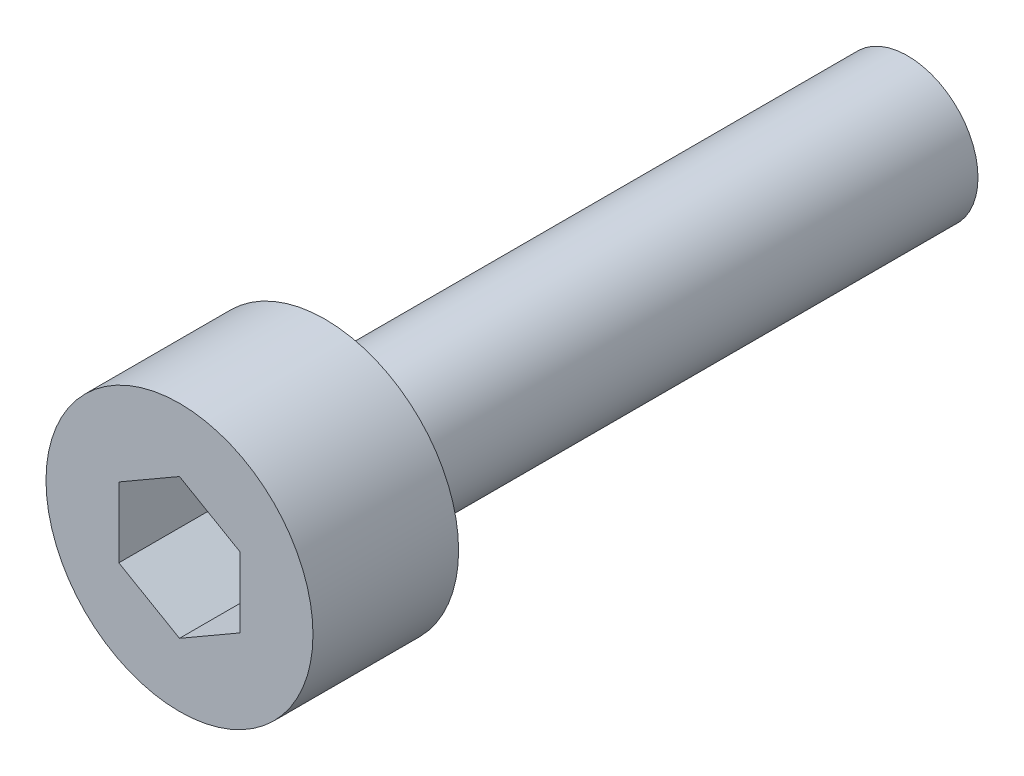
ISO-10303-21;
HEADER;
FILE_DESCRIPTION(('STEP AP214'),'2;1');
FILE_NAME('part.step','',(''),(''),'','','');
FILE_SCHEMA(('AUTOMOTIVE_DESIGN { 1 0 10303 214 1 1 1 1 }'));
ENDSEC;
DATA;
#1=APPLICATION_CONTEXT('core data for automotive mechanical design processes');
#2=APPLICATION_PROTOCOL_DEFINITION('international standard','automotive_design',2000,#1);
#3=PRODUCT_CONTEXT('',#1,'mechanical');
#4=PRODUCT('Part','Part','',(#3));
#5=PRODUCT_RELATED_PRODUCT_CATEGORY('part','',(#4));
#6=PRODUCT_DEFINITION_FORMATION('','',#4);
#7=PRODUCT_DEFINITION_CONTEXT('part definition',#1,'design');
#8=PRODUCT_DEFINITION('design','',#6,#7);
#9=PRODUCT_DEFINITION_SHAPE('','',#8);
#10=(LENGTH_UNIT() NAMED_UNIT(*) SI_UNIT(.MILLI.,.METRE.));
#11=(NAMED_UNIT(*) PLANE_ANGLE_UNIT() SI_UNIT($,.RADIAN.));
#12=(NAMED_UNIT(*) SI_UNIT($,.STERADIAN.) SOLID_ANGLE_UNIT());
#13=UNCERTAINTY_MEASURE_WITH_UNIT(LENGTH_MEASURE(1.E-05),#10,'distance_accuracy_value','');
#14=(GEOMETRIC_REPRESENTATION_CONTEXT(3) GLOBAL_UNCERTAINTY_ASSIGNED_CONTEXT((#13)) GLOBAL_UNIT_ASSIGNED_CONTEXT((#10,
#11,#12)) REPRESENTATION_CONTEXT('',''));
#15=CARTESIAN_POINT('',(0.,0.,0.));
#16=DIRECTION('',(0.,0.,1.));
#17=DIRECTION('',(1.,0.,0.));
#18=AXIS2_PLACEMENT_3D('',#15,#16,#17);
#19=CARTESIAN_POINT('',(0.,0.,-12.));
#20=DIRECTION('',(0.,0.,1.));
#21=DIRECTION('',(1.,0.,0.));
#22=AXIS2_PLACEMENT_3D('',#19,#20,#21);
#23=CYLINDRICAL_SURFACE('',#22,1.45);
#24=CARTESIAN_POINT('',(0.,0.,-12.));
#25=DIRECTION('',(0.,0.,1.));
#26=DIRECTION('',(1.,0.,0.));
#27=AXIS2_PLACEMENT_3D('',#24,#25,#26);
#28=CIRCLE('',#27,1.45);
#29=CARTESIAN_POINT('',(1.45,0.,-12.));
#30=VERTEX_POINT('',#29);
#31=EDGE_CURVE('E11',#30,#30,#28,.T.);
#32=ORIENTED_EDGE('',*,*,#31,.T.);
#33=EDGE_LOOP('',(#32));
#34=FACE_BOUND('',#33,.T.);
#35=CARTESIAN_POINT('',(0.,0.,0.));
#36=DIRECTION('',(0.,0.,1.));
#37=DIRECTION('',(1.,0.,0.));
#38=AXIS2_PLACEMENT_3D('',#35,#36,#37);
#39=CIRCLE('',#38,1.45);
#40=CARTESIAN_POINT('',(1.45,0.,0.));
#41=VERTEX_POINT('',#40);
#42=EDGE_CURVE('E44',#41,#41,#39,.T.);
#43=ORIENTED_EDGE('',*,*,#42,.F.);
#44=EDGE_LOOP('',(#43));
#45=FACE_BOUND('',#44,.T.);
#46=ADVANCED_FACE('F41',(#34,#45),#23,.T.);
#47=CARTESIAN_POINT('',(0.,0.,-12.));
#48=DIRECTION('',(0.,0.,1.));
#49=DIRECTION('',(1.,0.,0.));
#50=AXIS2_PLACEMENT_3D('',#47,#48,#49);
#51=PLANE('',#50);
#52=ORIENTED_EDGE('',*,*,#31,.F.);
#53=EDGE_LOOP('',(#52));
#54=FACE_BOUND('',#53,.T.);
#55=ADVANCED_FACE('F174',(#54),#51,.F.);
#56=CARTESIAN_POINT('',(0.,0.,3.));
#57=DIRECTION('',(0.,0.,-1.));
#58=DIRECTION('',(-1.,0.,0.));
#59=AXIS2_PLACEMENT_3D('',#56,#57,#58);
#60=CYLINDRICAL_SURFACE('',#59,2.75);
#61=CARTESIAN_POINT('',(0.,0.,3.));
#62=DIRECTION('',(0.,0.,1.));
#63=DIRECTION('',(1.,0.,0.));
#64=AXIS2_PLACEMENT_3D('',#61,#62,#63);
#65=CIRCLE('',#64,2.75);
#66=CARTESIAN_POINT('',(2.75,0.,3.));
#67=VERTEX_POINT('',#66);
#68=EDGE_CURVE('E148',#67,#67,#65,.T.);
#69=ORIENTED_EDGE('',*,*,#68,.F.);
#70=EDGE_LOOP('',(#69));
#71=FACE_BOUND('',#70,.T.);
#72=CARTESIAN_POINT('',(0.,0.,0.));
#73=DIRECTION('',(0.,0.,1.));
#74=DIRECTION('',(1.,0.,0.));
#75=AXIS2_PLACEMENT_3D('',#72,#73,#74);
#76=CIRCLE('',#75,2.75);
#77=CARTESIAN_POINT('',(2.75,0.,0.));
#78=VERTEX_POINT('',#77);
#79=EDGE_CURVE('E142',#78,#78,#76,.T.);
#80=ORIENTED_EDGE('',*,*,#79,.T.);
#81=EDGE_LOOP('',(#80));
#82=FACE_BOUND('',#81,.T.);
#83=ADVANCED_FACE('F154',(#71,#82),#60,.T.);
#84=CARTESIAN_POINT('',(0.,0.,3.));
#85=DIRECTION('',(0.,0.,1.));
#86=DIRECTION('',(1.,0.,0.));
#87=AXIS2_PLACEMENT_3D('',#84,#85,#86);
#88=PLANE('',#87);
#89=DIRECTION('',(0.,1.,0.));
#90=VECTOR('',#89,1.);
#91=CARTESIAN_POINT('',(1.25,-0.721687836487032,3.));
#92=LINE('',#91,#90);
#93=CARTESIAN_POINT('',(1.25,-0.721687836487032,3.));
#94=VERTEX_POINT('',#93);
#95=CARTESIAN_POINT('',(1.25,0.721687836487032,3.));
#96=VERTEX_POINT('',#95);
#97=EDGE_CURVE('E55',#94,#96,#92,.T.);
#98=ORIENTED_EDGE('',*,*,#97,.F.);
#99=DIRECTION('',(0.866025403784438,0.5,0.));
#100=VECTOR('',#99,1.);
#101=CARTESIAN_POINT('',(0.,-1.44337567297406,3.));
#102=LINE('',#101,#100);
#103=CARTESIAN_POINT('',(0.,-1.44337567297406,3.));
#104=VERTEX_POINT('',#103);
#105=EDGE_CURVE('E138',#104,#94,#102,.T.);
#106=ORIENTED_EDGE('',*,*,#105,.F.);
#107=DIRECTION('',(0.866025403784438,-0.5,0.));
#108=VECTOR('',#107,1.);
#109=CARTESIAN_POINT('',(-1.25,-0.721687836487032,3.));
#110=LINE('',#109,#108);
#111=CARTESIAN_POINT('',(-1.25,-0.721687836487032,3.));
#112=VERTEX_POINT('',#111);
#113=EDGE_CURVE('E136',#112,#104,#110,.T.);
#114=ORIENTED_EDGE('',*,*,#113,.F.);
#115=DIRECTION('',(0.,-1.,0.));
#116=VECTOR('',#115,1.);
#117=CARTESIAN_POINT('',(-1.25,0.721687836487033,3.));
#118=LINE('',#117,#116);
#119=CARTESIAN_POINT('',(-1.25,0.721687836487033,3.));
#120=VERTEX_POINT('',#119);
#121=EDGE_CURVE('E103',#120,#112,#118,.T.);
#122=ORIENTED_EDGE('',*,*,#121,.F.);
#123=DIRECTION('',(-0.866025403784439,-0.5,0.));
#124=VECTOR('',#123,1.);
#125=CARTESIAN_POINT('',(0.,1.44337567297406,3.));
#126=LINE('',#125,#124);
#127=CARTESIAN_POINT('',(0.,1.44337567297406,3.));
#128=VERTEX_POINT('',#127);
#129=EDGE_CURVE('E132',#128,#120,#126,.T.);
#130=ORIENTED_EDGE('',*,*,#129,.F.);
#131=DIRECTION('',(-0.866025403784439,0.5,0.));
#132=VECTOR('',#131,1.);
#133=CARTESIAN_POINT('',(1.25,0.721687836487032,3.));
#134=LINE('',#133,#132);
#135=EDGE_CURVE('E129',#96,#128,#134,.T.);
#136=ORIENTED_EDGE('',*,*,#135,.F.);
#137=EDGE_LOOP('',(#98,#106,#114,#122,#130,#136));
#138=FACE_BOUND('',#137,.T.);
#139=ORIENTED_EDGE('',*,*,#68,.T.);
#140=EDGE_LOOP('',(#139));
#141=FACE_BOUND('',#140,.T.);
#142=ADVANCED_FACE('F159',(#138,#141),#88,.T.);
#143=CARTESIAN_POINT('',(0.,0.,0.));
#144=DIRECTION('',(0.,0.,1.));
#145=DIRECTION('',(1.,0.,0.));
#146=AXIS2_PLACEMENT_3D('',#143,#144,#145);
#147=PLANE('',#146);
#148=ORIENTED_EDGE('',*,*,#42,.T.);
#149=EDGE_LOOP('',(#148));
#150=FACE_BOUND('',#149,.T.);
#151=ORIENTED_EDGE('',*,*,#79,.F.);
#152=EDGE_LOOP('',(#151));
#153=FACE_BOUND('',#152,.T.);
#154=ADVANCED_FACE('F156',(#150,#153),#147,.F.);
#155=CARTESIAN_POINT('',(1.25,-0.721687836487032,1.05));
#156=DIRECTION('',(1.,0.,0.));
#157=DIRECTION('',(0.,1.,0.));
#158=AXIS2_PLACEMENT_3D('',#155,#156,#157);
#159=PLANE('',#158);
#160=ORIENTED_EDGE('',*,*,#97,.T.);
#161=DIRECTION('',(0.,0.,1.));
#162=VECTOR('',#161,1.);
#163=CARTESIAN_POINT('',(1.25,0.721687836487032,1.05));
#164=LINE('',#163,#162);
#165=CARTESIAN_POINT('',(1.25,0.721687836487032,1.05));
#166=VERTEX_POINT('',#165);
#167=EDGE_CURVE('E85',#166,#96,#164,.T.);
#168=ORIENTED_EDGE('',*,*,#167,.F.);
#169=DIRECTION('',(0.,1.,0.));
#170=VECTOR('',#169,1.);
#171=CARTESIAN_POINT('',(1.25,-0.721687836487032,1.05));
#172=LINE('',#171,#170);
#173=CARTESIAN_POINT('',(1.25,-0.721687836487032,1.05));
#174=VERTEX_POINT('',#173);
#175=EDGE_CURVE('E140',#174,#166,#172,.T.);
#176=ORIENTED_EDGE('',*,*,#175,.F.);
#177=DIRECTION('',(0.,0.,1.));
#178=VECTOR('',#177,1.);
#179=CARTESIAN_POINT('',(1.25,-0.721687836487032,1.05));
#180=LINE('',#179,#178);
#181=EDGE_CURVE('E63',#174,#94,#180,.T.);
#182=ORIENTED_EDGE('',*,*,#181,.T.);
#183=EDGE_LOOP('',(#160,#168,#176,#182));
#184=FACE_BOUND('',#183,.T.);
#185=ADVANCED_FACE('F158',(#184),#159,.F.);
#186=CARTESIAN_POINT('',(0.,-1.44337567297406,1.05));
#187=DIRECTION('',(0.5,-0.866025403784439,0.));
#188=DIRECTION('',(0.866025403784439,0.5,0.));
#189=AXIS2_PLACEMENT_3D('',#186,#187,#188);
#190=PLANE('',#189);
#191=ORIENTED_EDGE('',*,*,#105,.T.);
#192=ORIENTED_EDGE('',*,*,#181,.F.);
#193=DIRECTION('',(0.866025403784438,0.5,0.));
#194=VECTOR('',#193,1.);
#195=CARTESIAN_POINT('',(0.,-1.44337567297406,1.05));
#196=LINE('',#195,#194);
#197=CARTESIAN_POINT('',(0.,-1.44337567297406,1.05));
#198=VERTEX_POINT('',#197);
#199=EDGE_CURVE('E115',#198,#174,#196,.T.);
#200=ORIENTED_EDGE('',*,*,#199,.F.);
#201=DIRECTION('',(0.,0.,1.));
#202=VECTOR('',#201,1.);
#203=CARTESIAN_POINT('',(0.,-1.44337567297406,1.05));
#204=LINE('',#203,#202);
#205=EDGE_CURVE('E107',#198,#104,#204,.T.);
#206=ORIENTED_EDGE('',*,*,#205,.T.);
#207=EDGE_LOOP('',(#191,#192,#200,#206));
#208=FACE_BOUND('',#207,.T.);
#209=ADVANCED_FACE('F167',(#208),#190,.F.);
#210=CARTESIAN_POINT('',(-1.25,-0.721687836487032,1.05));
#211=DIRECTION('',(-0.5,-0.866025403784439,0.));
#212=DIRECTION('',(0.866025403784439,-0.5,0.));
#213=AXIS2_PLACEMENT_3D('',#210,#211,#212);
#214=PLANE('',#213);
#215=ORIENTED_EDGE('',*,*,#113,.T.);
#216=ORIENTED_EDGE('',*,*,#205,.F.);
#217=DIRECTION('',(0.866025403784438,-0.5,0.));
#218=VECTOR('',#217,1.);
#219=CARTESIAN_POINT('',(-1.25,-0.721687836487032,1.05));
#220=LINE('',#219,#218);
#221=CARTESIAN_POINT('',(-1.25,-0.721687836487032,1.05));
#222=VERTEX_POINT('',#221);
#223=EDGE_CURVE('E111',#222,#198,#220,.T.);
#224=ORIENTED_EDGE('',*,*,#223,.F.);
#225=DIRECTION('',(0.,0.,1.));
#226=VECTOR('',#225,1.);
#227=CARTESIAN_POINT('',(-1.25,-0.721687836487032,1.05));
#228=LINE('',#227,#226);
#229=EDGE_CURVE('E96',#222,#112,#228,.T.);
#230=ORIENTED_EDGE('',*,*,#229,.T.);
#231=EDGE_LOOP('',(#215,#216,#224,#230));
#232=FACE_BOUND('',#231,.T.);
#233=ADVANCED_FACE('F112',(#232),#214,.F.);
#234=CARTESIAN_POINT('',(-1.25,0.721687836487033,1.05));
#235=DIRECTION('',(-1.,0.,0.));
#236=DIRECTION('',(0.,-1.,0.));
#237=AXIS2_PLACEMENT_3D('',#234,#235,#236);
#238=PLANE('',#237);
#239=ORIENTED_EDGE('',*,*,#121,.T.);
#240=ORIENTED_EDGE('',*,*,#229,.F.);
#241=DIRECTION('',(0.,-1.,0.));
#242=VECTOR('',#241,1.);
#243=CARTESIAN_POINT('',(-1.25,0.721687836487033,1.05));
#244=LINE('',#243,#242);
#245=CARTESIAN_POINT('',(-1.25,0.721687836487033,1.05));
#246=VERTEX_POINT('',#245);
#247=EDGE_CURVE('E100',#246,#222,#244,.T.);
#248=ORIENTED_EDGE('',*,*,#247,.F.);
#249=DIRECTION('',(0.,0.,1.));
#250=VECTOR('',#249,1.);
#251=CARTESIAN_POINT('',(-1.25,0.721687836487033,1.05));
#252=LINE('',#251,#250);
#253=EDGE_CURVE('E108',#246,#120,#252,.T.);
#254=ORIENTED_EDGE('',*,*,#253,.T.);
#255=EDGE_LOOP('',(#239,#240,#248,#254));
#256=FACE_BOUND('',#255,.T.);
#257=ADVANCED_FACE('F98',(#256),#238,.F.);
#258=CARTESIAN_POINT('',(0.,1.44337567297406,1.05));
#259=DIRECTION('',(-0.5,0.866025403784439,0.));
#260=DIRECTION('',(-0.866025403784439,-0.5,0.));
#261=AXIS2_PLACEMENT_3D('',#258,#259,#260);
#262=PLANE('',#261);
#263=ORIENTED_EDGE('',*,*,#129,.T.);
#264=ORIENTED_EDGE('',*,*,#253,.F.);
#265=DIRECTION('',(-0.866025403784439,-0.5,0.));
#266=VECTOR('',#265,1.);
#267=CARTESIAN_POINT('',(0.,1.44337567297406,1.05));
#268=LINE('',#267,#266);
#269=CARTESIAN_POINT('',(0.,1.44337567297406,1.05));
#270=VERTEX_POINT('',#269);
#271=EDGE_CURVE('E121',#270,#246,#268,.T.);
#272=ORIENTED_EDGE('',*,*,#271,.F.);
#273=DIRECTION('',(0.,0.,1.));
#274=VECTOR('',#273,1.);
#275=CARTESIAN_POINT('',(0.,1.44337567297406,1.05));
#276=LINE('',#275,#274);
#277=EDGE_CURVE('E145',#270,#128,#276,.T.);
#278=ORIENTED_EDGE('',*,*,#277,.T.);
#279=EDGE_LOOP('',(#263,#264,#272,#278));
#280=FACE_BOUND('',#279,.T.);
#281=ADVANCED_FACE('F235',(#280),#262,.F.);
#282=CARTESIAN_POINT('',(1.25,0.721687836487032,1.05));
#283=DIRECTION('',(0.5,0.866025403784439,0.));
#284=DIRECTION('',(-0.866025403784439,0.5,0.));
#285=AXIS2_PLACEMENT_3D('',#282,#283,#284);
#286=PLANE('',#285);
#287=ORIENTED_EDGE('',*,*,#135,.T.);
#288=ORIENTED_EDGE('',*,*,#277,.F.);
#289=DIRECTION('',(-0.866025403784439,0.5,0.));
#290=VECTOR('',#289,1.);
#291=CARTESIAN_POINT('',(1.25,0.721687836487032,1.05));
#292=LINE('',#291,#290);
#293=EDGE_CURVE('E123',#166,#270,#292,.T.);
#294=ORIENTED_EDGE('',*,*,#293,.F.);
#295=ORIENTED_EDGE('',*,*,#167,.T.);
#296=EDGE_LOOP('',(#287,#288,#294,#295));
#297=FACE_BOUND('',#296,.T.);
#298=ADVANCED_FACE('F244',(#297),#286,.F.);
#299=CARTESIAN_POINT('',(0.,0.,1.05));
#300=DIRECTION('',(0.,0.,1.));
#301=DIRECTION('',(1.,0.,0.));
#302=AXIS2_PLACEMENT_3D('',#299,#300,#301);
#303=PLANE('',#302);
#304=ORIENTED_EDGE('',*,*,#175,.T.);
#305=ORIENTED_EDGE('',*,*,#293,.T.);
#306=ORIENTED_EDGE('',*,*,#271,.T.);
#307=ORIENTED_EDGE('',*,*,#247,.T.);
#308=ORIENTED_EDGE('',*,*,#223,.T.);
#309=ORIENTED_EDGE('',*,*,#199,.T.);
#310=EDGE_LOOP('',(#304,#305,#306,#307,#308,#309));
#311=FACE_BOUND('',#310,.T.);
#312=ADVANCED_FACE('F118',(#311),#303,.T.);
#313=CLOSED_SHELL('',(#46,#55,#83,#142,#154,#185,#209,#233,#257,#281,#298,#312));
#314=MANIFOLD_SOLID_BREP('B2',#313);
#315=ADVANCED_BREP_SHAPE_REPRESENTATION('',(#18,#314),#14);
#316=SHAPE_DEFINITION_REPRESENTATION(#9,#315);
ENDSEC;
END-ISO-10303-21;
